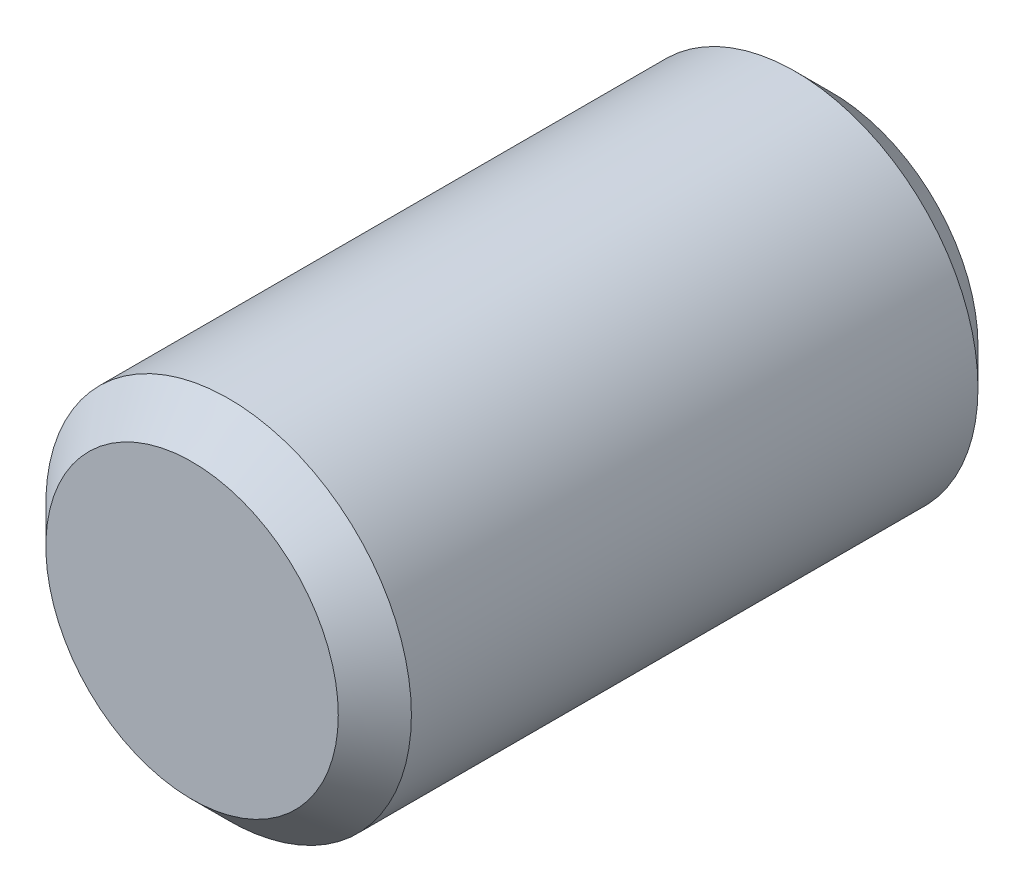
ISO-10303-21;
HEADER;
FILE_DESCRIPTION(('STEP AP214'),'2;1');
FILE_NAME('part.step','',(''),(''),'','','');
FILE_SCHEMA(('AUTOMOTIVE_DESIGN { 1 0 10303 214 1 1 1 1 }'));
ENDSEC;
DATA;
#1=APPLICATION_CONTEXT('core data for automotive mechanical design processes');
#2=APPLICATION_PROTOCOL_DEFINITION('international standard','automotive_design',2000,#1);
#3=PRODUCT_CONTEXT('',#1,'mechanical');
#4=PRODUCT('Part','Part','',(#3));
#5=PRODUCT_RELATED_PRODUCT_CATEGORY('part','',(#4));
#6=PRODUCT_DEFINITION_FORMATION('','',#4);
#7=PRODUCT_DEFINITION_CONTEXT('part definition',#1,'design');
#8=PRODUCT_DEFINITION('design','',#6,#7);
#9=PRODUCT_DEFINITION_SHAPE('','',#8);
#10=(LENGTH_UNIT() NAMED_UNIT(*) SI_UNIT(.MILLI.,.METRE.));
#11=(NAMED_UNIT(*) PLANE_ANGLE_UNIT() SI_UNIT($,.RADIAN.));
#12=(NAMED_UNIT(*) SI_UNIT($,.STERADIAN.) SOLID_ANGLE_UNIT());
#13=UNCERTAINTY_MEASURE_WITH_UNIT(LENGTH_MEASURE(1.E-05),#10,'distance_accuracy_value','');
#14=(GEOMETRIC_REPRESENTATION_CONTEXT(3) GLOBAL_UNCERTAINTY_ASSIGNED_CONTEXT((#13)) GLOBAL_UNIT_ASSIGNED_CONTEXT((#10,
#11,#12)) REPRESENTATION_CONTEXT('',''));
#15=CARTESIAN_POINT('',(0.,0.,0.));
#16=DIRECTION('',(0.,0.,1.));
#17=DIRECTION('',(1.,0.,0.));
#18=AXIS2_PLACEMENT_3D('',#15,#16,#17);
#19=CARTESIAN_POINT('',(0.,0.,8.75));
#20=DIRECTION('',(0.,0.,-1.));
#21=DIRECTION('',(-1.,0.,0.));
#22=AXIS2_PLACEMENT_3D('',#19,#20,#21);
#23=CYLINDRICAL_SURFACE('',#22,5.);
#24=CARTESIAN_POINT('',(0.,0.,-7.75000000000001));
#25=DIRECTION('',(0.,0.,1.));
#26=DIRECTION('',(1.,0.,0.));
#27=AXIS2_PLACEMENT_3D('',#24,#25,#26);
#28=CIRCLE('',#27,5.);
#29=CARTESIAN_POINT('',(5.,0.,-7.75000000000001));
#30=VERTEX_POINT('',#29);
#31=EDGE_CURVE('E41',#30,#30,#28,.T.);
#32=ORIENTED_EDGE('',*,*,#31,.T.);
#33=EDGE_LOOP('',(#32));
#34=FACE_BOUND('',#33,.T.);
#35=CARTESIAN_POINT('',(0.,0.,7.75));
#36=DIRECTION('',(0.,0.,1.));
#37=DIRECTION('',(1.,0.,0.));
#38=AXIS2_PLACEMENT_3D('',#35,#36,#37);
#39=CIRCLE('',#38,5.);
#40=CARTESIAN_POINT('',(5.,0.,7.75));
#41=VERTEX_POINT('',#40);
#42=EDGE_CURVE('E45',#41,#41,#39,.F.);
#43=ORIENTED_EDGE('',*,*,#42,.T.);
#44=EDGE_LOOP('',(#43));
#45=FACE_BOUND('',#44,.T.);
#46=ADVANCED_FACE('F30',(#34,#45),#23,.T.);
#47=CARTESIAN_POINT('',(0.,0.,8.75));
#48=DIRECTION('',(0.,0.,1.));
#49=DIRECTION('',(1.,0.,0.));
#50=AXIS2_PLACEMENT_3D('',#47,#48,#49);
#51=PLANE('',#50);
#52=CARTESIAN_POINT('',(0.,0.,8.75));
#53=DIRECTION('',(0.,0.,1.));
#54=DIRECTION('',(1.,0.,0.));
#55=AXIS2_PLACEMENT_3D('',#52,#53,#54);
#56=CIRCLE('',#55,4.);
#57=CARTESIAN_POINT('',(4.,0.,8.75));
#58=VERTEX_POINT('',#57);
#59=EDGE_CURVE('E10',#58,#58,#56,.T.);
#60=ORIENTED_EDGE('',*,*,#59,.T.);
#61=EDGE_LOOP('',(#60));
#62=FACE_BOUND('',#61,.T.);
#63=ADVANCED_FACE('F61',(#62),#51,.T.);
#64=CARTESIAN_POINT('',(0.,0.,-8.75));
#65=DIRECTION('',(0.,0.,1.));
#66=DIRECTION('',(1.,0.,0.));
#67=AXIS2_PLACEMENT_3D('',#64,#65,#66);
#68=PLANE('',#67);
#69=CARTESIAN_POINT('',(0.,0.,-8.75));
#70=DIRECTION('',(0.,0.,1.));
#71=DIRECTION('',(1.,0.,0.));
#72=AXIS2_PLACEMENT_3D('',#69,#70,#71);
#73=CIRCLE('',#72,4.);
#74=CARTESIAN_POINT('',(4.,0.,-8.75));
#75=VERTEX_POINT('',#74);
#76=EDGE_CURVE('E37',#75,#75,#73,.F.);
#77=ORIENTED_EDGE('',*,*,#76,.T.);
#78=EDGE_LOOP('',(#77));
#79=FACE_BOUND('',#78,.T.);
#80=ADVANCED_FACE('F58',(#79),#68,.F.);
#81=CARTESIAN_POINT('',(0.,0.,-7.75000000000001));
#82=DIRECTION('',(0.,0.,1.));
#83=DIRECTION('',(1.,0.,0.));
#84=AXIS2_PLACEMENT_3D('',#81,#82,#83);
#85=CONICAL_SURFACE('',#84,5.,0.785398163397451);
#86=ORIENTED_EDGE('',*,*,#76,.F.);
#87=EDGE_LOOP('',(#86));
#88=FACE_BOUND('',#87,.T.);
#89=ORIENTED_EDGE('',*,*,#31,.F.);
#90=EDGE_LOOP('',(#89));
#91=FACE_BOUND('',#90,.T.);
#92=ADVANCED_FACE('F54',(#88,#91),#85,.T.);
#93=CARTESIAN_POINT('',(0.,0.,8.75));
#94=DIRECTION('',(0.,0.,-1.));
#95=DIRECTION('',(-1.,0.,0.));
#96=AXIS2_PLACEMENT_3D('',#93,#94,#95);
#97=CONICAL_SURFACE('',#96,4.,0.785398163397447);
#98=ORIENTED_EDGE('',*,*,#42,.F.);
#99=EDGE_LOOP('',(#98));
#100=FACE_BOUND('',#99,.T.);
#101=ORIENTED_EDGE('',*,*,#59,.F.);
#102=EDGE_LOOP('',(#101));
#103=FACE_BOUND('',#102,.T.);
#104=ADVANCED_FACE('F32',(#100,#103),#97,.T.);
#105=CLOSED_SHELL('',(#46,#63,#80,#92,#104));
#106=MANIFOLD_SOLID_BREP('B2',#105);
#107=ADVANCED_BREP_SHAPE_REPRESENTATION('',(#18,#106),#14);
#108=SHAPE_DEFINITION_REPRESENTATION(#9,#107);
ENDSEC;
END-ISO-10303-21;
